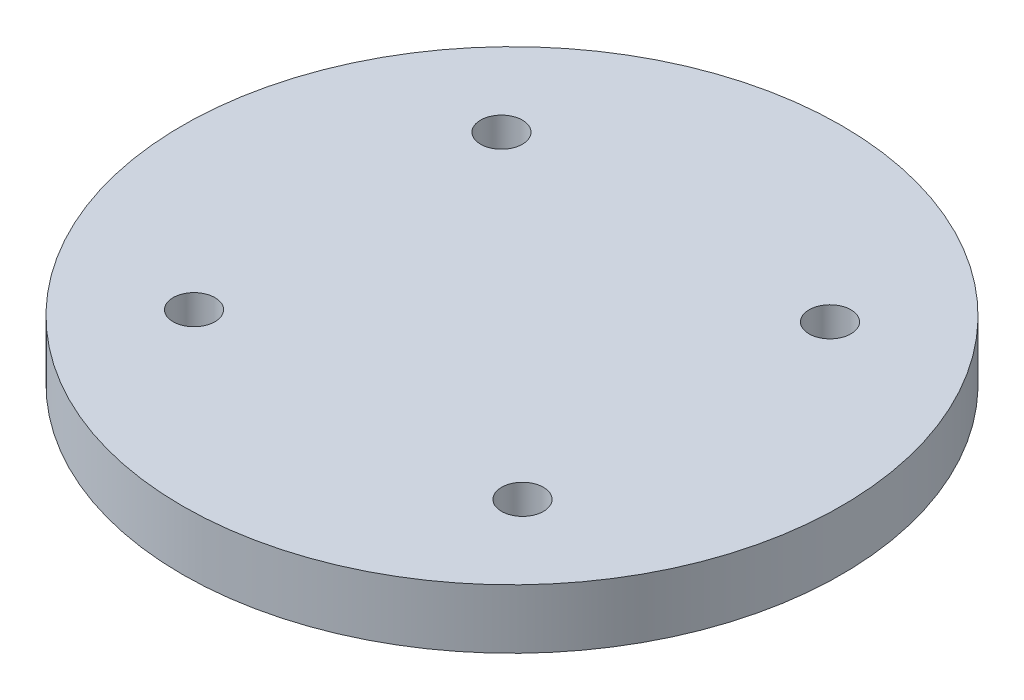
ISO-10303-21;
HEADER;
FILE_DESCRIPTION(('STEP AP214'),'2;1');
FILE_NAME('part.step','',(''),(''),'','','');
FILE_SCHEMA(('AUTOMOTIVE_DESIGN { 1 0 10303 214 1 1 1 1 }'));
ENDSEC;
DATA;
#1=APPLICATION_CONTEXT('core data for automotive mechanical design processes');
#2=APPLICATION_PROTOCOL_DEFINITION('international standard','automotive_design',2000,#1);
#3=PRODUCT_CONTEXT('',#1,'mechanical');
#4=PRODUCT('Part','Part','',(#3));
#5=PRODUCT_RELATED_PRODUCT_CATEGORY('part','',(#4));
#6=PRODUCT_DEFINITION_FORMATION('','',#4);
#7=PRODUCT_DEFINITION_CONTEXT('part definition',#1,'design');
#8=PRODUCT_DEFINITION('design','',#6,#7);
#9=PRODUCT_DEFINITION_SHAPE('','',#8);
#10=(LENGTH_UNIT() NAMED_UNIT(*) SI_UNIT(.MILLI.,.METRE.));
#11=(NAMED_UNIT(*) PLANE_ANGLE_UNIT() SI_UNIT($,.RADIAN.));
#12=(NAMED_UNIT(*) SI_UNIT($,.STERADIAN.) SOLID_ANGLE_UNIT());
#13=UNCERTAINTY_MEASURE_WITH_UNIT(LENGTH_MEASURE(1.E-05),#10,'distance_accuracy_value','');
#14=(GEOMETRIC_REPRESENTATION_CONTEXT(3) GLOBAL_UNCERTAINTY_ASSIGNED_CONTEXT((#13)) GLOBAL_UNIT_ASSIGNED_CONTEXT((#10,
#11,#12)) REPRESENTATION_CONTEXT('',''));
#15=CARTESIAN_POINT('',(0.,0.,0.));
#16=DIRECTION('',(0.,0.,1.));
#17=DIRECTION('',(1.,0.,0.));
#18=AXIS2_PLACEMENT_3D('',#15,#16,#17);
#19=CARTESIAN_POINT('',(0.,9.,0.));
#20=DIRECTION('',(0.,1.,0.));
#21=DIRECTION('',(0.,0.,1.));
#22=AXIS2_PLACEMENT_3D('',#19,#20,#21);
#23=PLANE('',#22);
#24=CARTESIAN_POINT('',(24.92,9.,23.325));
#25=DIRECTION('',(0.,-1.,0.));
#26=DIRECTION('',(0.,0.,-1.));
#27=AXIS2_PLACEMENT_3D('',#24,#25,#26);
#28=CIRCLE('',#27,3.175);
#29=CARTESIAN_POINT('',(24.92,9.,20.15));
#30=VERTEX_POINT('',#29);
#31=EDGE_CURVE('E47',#30,#30,#28,.T.);
#32=ORIENTED_EDGE('',*,*,#31,.T.);
#33=EDGE_LOOP('',(#32));
#34=FACE_BOUND('',#33,.T.);
#35=CARTESIAN_POINT('',(-24.92,9.,-23.325));
#36=DIRECTION('',(0.,-1.,0.));
#37=DIRECTION('',(0.,0.,-1.));
#38=AXIS2_PLACEMENT_3D('',#35,#36,#37);
#39=CIRCLE('',#38,3.17500000000001);
#40=CARTESIAN_POINT('',(-24.92,9.,-26.5));
#41=VERTEX_POINT('',#40);
#42=EDGE_CURVE('E53',#41,#41,#39,.T.);
#43=ORIENTED_EDGE('',*,*,#42,.T.);
#44=EDGE_LOOP('',(#43));
#45=FACE_BOUND('',#44,.T.);
#46=CARTESIAN_POINT('',(-24.92,9.,23.325));
#47=DIRECTION('',(0.,1.,0.));
#48=DIRECTION('',(0.,0.,1.));
#49=AXIS2_PLACEMENT_3D('',#46,#47,#48);
#50=CIRCLE('',#49,3.175);
#51=CARTESIAN_POINT('',(-24.92,9.,26.5));
#52=VERTEX_POINT('',#51);
#53=EDGE_CURVE('E44',#52,#52,#50,.T.);
#54=ORIENTED_EDGE('',*,*,#53,.F.);
#55=EDGE_LOOP('',(#54));
#56=FACE_BOUND('',#55,.T.);
#57=CARTESIAN_POINT('',(0.,9.,0.));
#58=DIRECTION('',(0.,1.,0.));
#59=DIRECTION('',(0.,0.,1.));
#60=AXIS2_PLACEMENT_3D('',#57,#58,#59);
#61=CIRCLE('',#60,50.);
#62=CARTESIAN_POINT('',(0.,9.,50.));
#63=VERTEX_POINT('',#62);
#64=EDGE_CURVE('E10',#63,#63,#61,.T.);
#65=ORIENTED_EDGE('',*,*,#64,.T.);
#66=EDGE_LOOP('',(#65));
#67=FACE_BOUND('',#66,.T.);
#68=CARTESIAN_POINT('',(24.92,9.,-23.325));
#69=DIRECTION('',(0.,1.,0.));
#70=DIRECTION('',(0.,0.,1.));
#71=AXIS2_PLACEMENT_3D('',#68,#69,#70);
#72=CIRCLE('',#71,3.17499999999999);
#73=CARTESIAN_POINT('',(24.92,9.,-20.15));
#74=VERTEX_POINT('',#73);
#75=EDGE_CURVE('E59',#74,#74,#72,.T.);
#76=ORIENTED_EDGE('',*,*,#75,.F.);
#77=EDGE_LOOP('',(#76));
#78=FACE_BOUND('',#77,.T.);
#79=ADVANCED_FACE('F31',(#34,#45,#56,#67,#78),#23,.T.);
#80=CARTESIAN_POINT('',(0.,0.,0.));
#81=DIRECTION('',(0.,1.,0.));
#82=DIRECTION('',(0.,0.,1.));
#83=AXIS2_PLACEMENT_3D('',#80,#81,#82);
#84=PLANE('',#83);
#85=CARTESIAN_POINT('',(24.92,0.,23.325));
#86=DIRECTION('',(0.,-1.,0.));
#87=DIRECTION('',(0.,0.,-1.));
#88=AXIS2_PLACEMENT_3D('',#85,#86,#87);
#89=CIRCLE('',#88,3.175);
#90=CARTESIAN_POINT('',(24.92,0.,20.15));
#91=VERTEX_POINT('',#90);
#92=EDGE_CURVE('E62',#91,#91,#89,.T.);
#93=ORIENTED_EDGE('',*,*,#92,.F.);
#94=EDGE_LOOP('',(#93));
#95=FACE_BOUND('',#94,.T.);
#96=CARTESIAN_POINT('',(0.,0.,0.));
#97=DIRECTION('',(0.,1.,0.));
#98=DIRECTION('',(0.,0.,1.));
#99=AXIS2_PLACEMENT_3D('',#96,#97,#98);
#100=CIRCLE('',#99,50.);
#101=CARTESIAN_POINT('',(0.,0.,50.));
#102=VERTEX_POINT('',#101);
#103=EDGE_CURVE('E35',#102,#102,#100,.T.);
#104=ORIENTED_EDGE('',*,*,#103,.F.);
#105=EDGE_LOOP('',(#104));
#106=FACE_BOUND('',#105,.T.);
#107=CARTESIAN_POINT('',(-24.92,0.,23.325));
#108=DIRECTION('',(0.,1.,0.));
#109=DIRECTION('',(0.,0.,1.));
#110=AXIS2_PLACEMENT_3D('',#107,#108,#109);
#111=CIRCLE('',#110,3.175);
#112=CARTESIAN_POINT('',(-24.92,0.,26.5));
#113=VERTEX_POINT('',#112);
#114=EDGE_CURVE('E42',#113,#113,#111,.T.);
#115=ORIENTED_EDGE('',*,*,#114,.T.);
#116=EDGE_LOOP('',(#115));
#117=FACE_BOUND('',#116,.T.);
#118=CARTESIAN_POINT('',(-24.92,0.,-23.325));
#119=DIRECTION('',(0.,-1.,0.));
#120=DIRECTION('',(0.,0.,-1.));
#121=AXIS2_PLACEMENT_3D('',#118,#119,#120);
#122=CIRCLE('',#121,3.17500000000001);
#123=CARTESIAN_POINT('',(-24.92,0.,-26.5));
#124=VERTEX_POINT('',#123);
#125=EDGE_CURVE('E50',#124,#124,#122,.T.);
#126=ORIENTED_EDGE('',*,*,#125,.F.);
#127=EDGE_LOOP('',(#126));
#128=FACE_BOUND('',#127,.T.);
#129=CARTESIAN_POINT('',(24.92,0.,-23.325));
#130=DIRECTION('',(0.,1.,0.));
#131=DIRECTION('',(0.,0.,1.));
#132=AXIS2_PLACEMENT_3D('',#129,#130,#131);
#133=CIRCLE('',#132,3.17499999999999);
#134=CARTESIAN_POINT('',(24.92,0.,-20.15));
#135=VERTEX_POINT('',#134);
#136=EDGE_CURVE('E56',#135,#135,#133,.T.);
#137=ORIENTED_EDGE('',*,*,#136,.T.);
#138=EDGE_LOOP('',(#137));
#139=FACE_BOUND('',#138,.T.);
#140=ADVANCED_FACE('F82',(#95,#106,#117,#128,#139),#84,.F.);
#141=CARTESIAN_POINT('',(0.,9.,0.));
#142=DIRECTION('',(0.,-1.,0.));
#143=DIRECTION('',(0.,0.,-1.));
#144=AXIS2_PLACEMENT_3D('',#141,#142,#143);
#145=CYLINDRICAL_SURFACE('',#144,50.);
#146=ORIENTED_EDGE('',*,*,#64,.F.);
#147=EDGE_LOOP('',(#146));
#148=FACE_BOUND('',#147,.T.);
#149=ORIENTED_EDGE('',*,*,#103,.T.);
#150=EDGE_LOOP('',(#149));
#151=FACE_BOUND('',#150,.T.);
#152=ADVANCED_FACE('F33',(#148,#151),#145,.T.);
#153=CARTESIAN_POINT('',(-24.92,0.,23.325));
#154=DIRECTION('',(0.,1.,0.));
#155=DIRECTION('',(0.,0.,1.));
#156=AXIS2_PLACEMENT_3D('',#153,#154,#155);
#157=CYLINDRICAL_SURFACE('',#156,3.175);
#158=ORIENTED_EDGE('',*,*,#114,.F.);
#159=EDGE_LOOP('',(#158));
#160=FACE_BOUND('',#159,.T.);
#161=ORIENTED_EDGE('',*,*,#53,.T.);
#162=EDGE_LOOP('',(#161));
#163=FACE_BOUND('',#162,.T.);
#164=ADVANCED_FACE('F89',(#160,#163),#157,.F.);
#165=CARTESIAN_POINT('',(-24.92,0.,-23.325));
#166=DIRECTION('',(0.,1.,0.));
#167=DIRECTION('',(0.,0.,1.));
#168=AXIS2_PLACEMENT_3D('',#165,#166,#167);
#169=CYLINDRICAL_SURFACE('',#168,3.17500000000001);
#170=ORIENTED_EDGE('',*,*,#125,.T.);
#171=EDGE_LOOP('',(#170));
#172=FACE_BOUND('',#171,.T.);
#173=ORIENTED_EDGE('',*,*,#42,.F.);
#174=EDGE_LOOP('',(#173));
#175=FACE_BOUND('',#174,.T.);
#176=ADVANCED_FACE('F78',(#172,#175),#169,.F.);
#177=CARTESIAN_POINT('',(24.92,0.,-23.325));
#178=DIRECTION('',(0.,1.,0.));
#179=DIRECTION('',(0.,0.,1.));
#180=AXIS2_PLACEMENT_3D('',#177,#178,#179);
#181=CYLINDRICAL_SURFACE('',#180,3.17499999999999);
#182=ORIENTED_EDGE('',*,*,#136,.F.);
#183=EDGE_LOOP('',(#182));
#184=FACE_BOUND('',#183,.T.);
#185=ORIENTED_EDGE('',*,*,#75,.T.);
#186=EDGE_LOOP('',(#185));
#187=FACE_BOUND('',#186,.T.);
#188=ADVANCED_FACE('F72',(#184,#187),#181,.F.);
#189=CARTESIAN_POINT('',(24.92,0.,23.325));
#190=DIRECTION('',(0.,1.,0.));
#191=DIRECTION('',(0.,0.,1.));
#192=AXIS2_PLACEMENT_3D('',#189,#190,#191);
#193=CYLINDRICAL_SURFACE('',#192,3.175);
#194=ORIENTED_EDGE('',*,*,#92,.T.);
#195=EDGE_LOOP('',(#194));
#196=FACE_BOUND('',#195,.T.);
#197=ORIENTED_EDGE('',*,*,#31,.F.);
#198=EDGE_LOOP('',(#197));
#199=FACE_BOUND('',#198,.T.);
#200=ADVANCED_FACE('F70',(#196,#199),#193,.F.);
#201=CLOSED_SHELL('',(#79,#140,#152,#164,#176,#188,#200));
#202=MANIFOLD_SOLID_BREP('B2',#201);
#203=ADVANCED_BREP_SHAPE_REPRESENTATION('',(#18,#202),#14);
#204=SHAPE_DEFINITION_REPRESENTATION(#9,#203);
ENDSEC;
END-ISO-10303-21;
